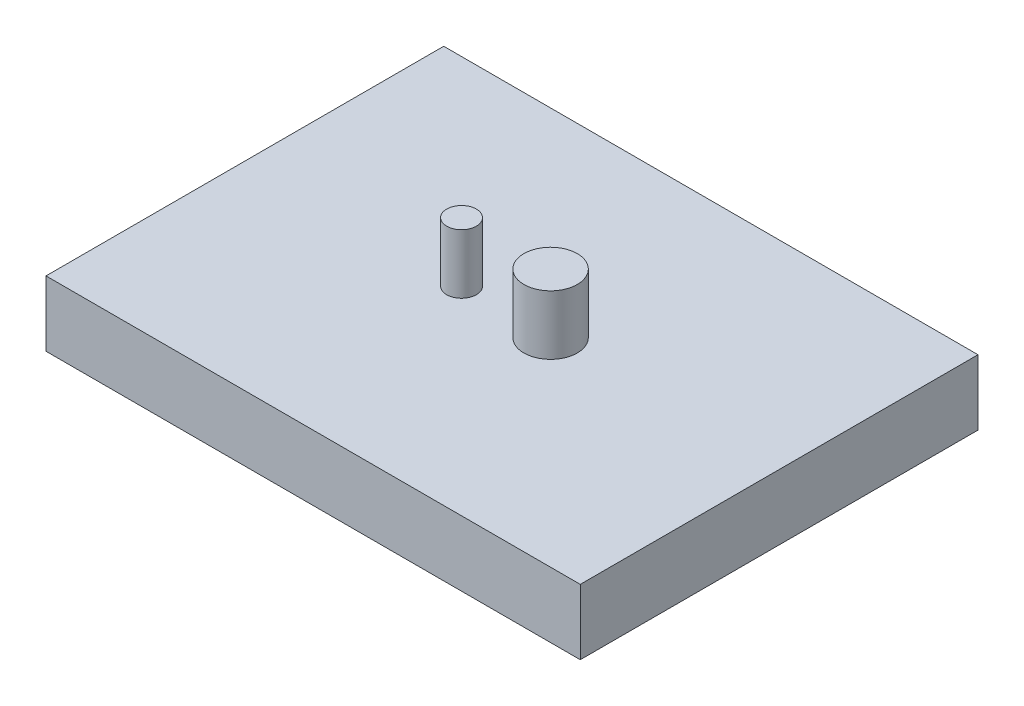
ISO-10303-21;
HEADER;
FILE_DESCRIPTION(('STEP AP214'),'2;1');
FILE_NAME('part.step','',(''),(''),'','','');
FILE_SCHEMA(('AUTOMOTIVE_DESIGN { 1 0 10303 214 1 1 1 1 }'));
ENDSEC;
DATA;
#1=APPLICATION_CONTEXT('core data for automotive mechanical design processes');
#2=APPLICATION_PROTOCOL_DEFINITION('international standard','automotive_design',2000,#1);
#3=PRODUCT_CONTEXT('',#1,'mechanical');
#4=PRODUCT('Part','Part','',(#3));
#5=PRODUCT_RELATED_PRODUCT_CATEGORY('part','',(#4));
#6=PRODUCT_DEFINITION_FORMATION('','',#4);
#7=PRODUCT_DEFINITION_CONTEXT('part definition',#1,'design');
#8=PRODUCT_DEFINITION('design','',#6,#7);
#9=PRODUCT_DEFINITION_SHAPE('','',#8);
#10=(LENGTH_UNIT() NAMED_UNIT(*) SI_UNIT(.MILLI.,.METRE.));
#11=(NAMED_UNIT(*) PLANE_ANGLE_UNIT() SI_UNIT($,.RADIAN.));
#12=(NAMED_UNIT(*) SI_UNIT($,.STERADIAN.) SOLID_ANGLE_UNIT());
#13=UNCERTAINTY_MEASURE_WITH_UNIT(LENGTH_MEASURE(1.E-05),#10,'distance_accuracy_value','');
#14=(GEOMETRIC_REPRESENTATION_CONTEXT(3) GLOBAL_UNCERTAINTY_ASSIGNED_CONTEXT((#13)) GLOBAL_UNIT_ASSIGNED_CONTEXT((#10,
#11,#12)) REPRESENTATION_CONTEXT('',''));
#15=CARTESIAN_POINT('',(0.,0.,0.));
#16=DIRECTION('',(0.,0.,1.));
#17=DIRECTION('',(1.,0.,0.));
#18=AXIS2_PLACEMENT_3D('',#15,#16,#17);
#19=CARTESIAN_POINT('',(0.,11.,0.));
#20=DIRECTION('',(0.,1.,0.));
#21=DIRECTION('',(0.,0.,1.));
#22=AXIS2_PLACEMENT_3D('',#19,#20,#21);
#23=PLANE('',#22);
#24=CARTESIAN_POINT('',(36.5,11.,33.5));
#25=DIRECTION('',(0.,1.,0.));
#26=DIRECTION('',(0.,0.,1.));
#27=AXIS2_PLACEMENT_3D('',#24,#25,#26);
#28=CIRCLE('',#27,2.5);
#29=CARTESIAN_POINT('',(36.5,11.,36.));
#30=VERTEX_POINT('',#29);
#31=EDGE_CURVE('E113',#30,#30,#28,.T.);
#32=ORIENTED_EDGE('',*,*,#31,.F.);
#33=EDGE_LOOP('',(#32));
#34=FACE_BOUND('',#33,.T.);
#35=DIRECTION('',(0.,0.,1.));
#36=VECTOR('',#35,1.);
#37=CARTESIAN_POINT('',(0.,11.,0.));
#38=LINE('',#37,#36);
#39=CARTESIAN_POINT('',(0.,11.,0.));
#40=VERTEX_POINT('',#39);
#41=CARTESIAN_POINT('',(0.,11.,67.));
#42=VERTEX_POINT('',#41);
#43=EDGE_CURVE('E87',#40,#42,#38,.T.);
#44=ORIENTED_EDGE('',*,*,#43,.T.);
#45=DIRECTION('',(1.,0.,0.));
#46=VECTOR('',#45,1.);
#47=CARTESIAN_POINT('',(0.,11.,67.));
#48=LINE('',#47,#46);
#49=CARTESIAN_POINT('',(90.,11.,67.));
#50=VERTEX_POINT('',#49);
#51=EDGE_CURVE('E82',#42,#50,#48,.T.);
#52=ORIENTED_EDGE('',*,*,#51,.T.);
#53=DIRECTION('',(0.,0.,-1.));
#54=VECTOR('',#53,1.);
#55=CARTESIAN_POINT('',(90.,11.,0.));
#56=LINE('',#55,#54);
#57=CARTESIAN_POINT('',(90.,11.,0.));
#58=VERTEX_POINT('',#57);
#59=EDGE_CURVE('E85',#50,#58,#56,.T.);
#60=ORIENTED_EDGE('',*,*,#59,.T.);
#61=DIRECTION('',(-1.,0.,0.));
#62=VECTOR('',#61,1.);
#63=CARTESIAN_POINT('',(0.,11.,0.));
#64=LINE('',#63,#62);
#65=EDGE_CURVE('E52',#58,#40,#64,.T.);
#66=ORIENTED_EDGE('',*,*,#65,.T.);
#67=EDGE_LOOP('',(#44,#52,#60,#66));
#68=FACE_BOUND('',#67,.T.);
#69=CARTESIAN_POINT('',(51.5,11.,33.5));
#70=DIRECTION('',(0.,1.,0.));
#71=DIRECTION('',(0.,0.,1.));
#72=AXIS2_PLACEMENT_3D('',#69,#70,#71);
#73=CIRCLE('',#72,4.5);
#74=CARTESIAN_POINT('',(51.5,11.,38.));
#75=VERTEX_POINT('',#74);
#76=EDGE_CURVE('E119',#75,#75,#73,.T.);
#77=ORIENTED_EDGE('',*,*,#76,.F.);
#78=EDGE_LOOP('',(#77));
#79=FACE_BOUND('',#78,.T.);
#80=ADVANCED_FACE('F35',(#34,#68,#79),#23,.T.);
#81=CARTESIAN_POINT('',(0.,11.,0.));
#82=DIRECTION('',(1.,0.,0.));
#83=DIRECTION('',(0.,0.,-1.));
#84=AXIS2_PLACEMENT_3D('',#81,#82,#83);
#85=PLANE('',#84);
#86=DIRECTION('',(0.,0.,1.));
#87=VECTOR('',#86,1.);
#88=CARTESIAN_POINT('',(0.,0.,0.));
#89=LINE('',#88,#87);
#90=CARTESIAN_POINT('',(0.,0.,0.));
#91=VERTEX_POINT('',#90);
#92=CARTESIAN_POINT('',(0.,0.,67.));
#93=VERTEX_POINT('',#92);
#94=EDGE_CURVE('E99',#91,#93,#89,.T.);
#95=ORIENTED_EDGE('',*,*,#94,.T.);
#96=DIRECTION('',(0.,-1.,0.));
#97=VECTOR('',#96,1.);
#98=CARTESIAN_POINT('',(0.,11.,67.));
#99=LINE('',#98,#97);
#100=EDGE_CURVE('E11',#42,#93,#99,.T.);
#101=ORIENTED_EDGE('',*,*,#100,.F.);
#102=ORIENTED_EDGE('',*,*,#43,.F.);
#103=DIRECTION('',(0.,-1.,0.));
#104=VECTOR('',#103,1.);
#105=CARTESIAN_POINT('',(0.,11.,0.));
#106=LINE('',#105,#104);
#107=EDGE_CURVE('E95',#40,#91,#106,.T.);
#108=ORIENTED_EDGE('',*,*,#107,.T.);
#109=EDGE_LOOP('',(#95,#101,#102,#108));
#110=FACE_BOUND('',#109,.T.);
#111=ADVANCED_FACE('F37',(#110),#85,.F.);
#112=CARTESIAN_POINT('',(0.,11.,67.));
#113=DIRECTION('',(0.,0.,-1.));
#114=DIRECTION('',(-1.,0.,0.));
#115=AXIS2_PLACEMENT_3D('',#112,#113,#114);
#116=PLANE('',#115);
#117=DIRECTION('',(1.,0.,0.));
#118=VECTOR('',#117,1.);
#119=CARTESIAN_POINT('',(0.,0.,67.));
#120=LINE('',#119,#118);
#121=CARTESIAN_POINT('',(90.,0.,67.));
#122=VERTEX_POINT('',#121);
#123=EDGE_CURVE('E91',#93,#122,#120,.T.);
#124=ORIENTED_EDGE('',*,*,#123,.T.);
#125=DIRECTION('',(0.,-1.,0.));
#126=VECTOR('',#125,1.);
#127=CARTESIAN_POINT('',(90.,11.,67.));
#128=LINE('',#127,#126);
#129=EDGE_CURVE('E44',#50,#122,#128,.T.);
#130=ORIENTED_EDGE('',*,*,#129,.F.);
#131=ORIENTED_EDGE('',*,*,#51,.F.);
#132=ORIENTED_EDGE('',*,*,#100,.T.);
#133=EDGE_LOOP('',(#124,#130,#131,#132));
#134=FACE_BOUND('',#133,.T.);
#135=ADVANCED_FACE('F90',(#134),#116,.F.);
#136=CARTESIAN_POINT('',(90.,11.,0.));
#137=DIRECTION('',(-1.,0.,0.));
#138=DIRECTION('',(0.,0.,1.));
#139=AXIS2_PLACEMENT_3D('',#136,#137,#138);
#140=PLANE('',#139);
#141=DIRECTION('',(0.,0.,-1.));
#142=VECTOR('',#141,1.);
#143=CARTESIAN_POINT('',(90.,0.,0.));
#144=LINE('',#143,#142);
#145=CARTESIAN_POINT('',(90.,0.,0.));
#146=VERTEX_POINT('',#145);
#147=EDGE_CURVE('E69',#122,#146,#144,.T.);
#148=ORIENTED_EDGE('',*,*,#147,.T.);
#149=DIRECTION('',(0.,-1.,0.));
#150=VECTOR('',#149,1.);
#151=CARTESIAN_POINT('',(90.,11.,0.));
#152=LINE('',#151,#150);
#153=EDGE_CURVE('E92',#58,#146,#152,.T.);
#154=ORIENTED_EDGE('',*,*,#153,.F.);
#155=ORIENTED_EDGE('',*,*,#59,.F.);
#156=ORIENTED_EDGE('',*,*,#129,.T.);
#157=EDGE_LOOP('',(#148,#154,#155,#156));
#158=FACE_BOUND('',#157,.T.);
#159=ADVANCED_FACE('F93',(#158),#140,.F.);
#160=CARTESIAN_POINT('',(0.,11.,0.));
#161=DIRECTION('',(0.,0.,1.));
#162=DIRECTION('',(1.,0.,0.));
#163=AXIS2_PLACEMENT_3D('',#160,#161,#162);
#164=PLANE('',#163);
#165=DIRECTION('',(-1.,0.,0.));
#166=VECTOR('',#165,1.);
#167=CARTESIAN_POINT('',(0.,0.,0.));
#168=LINE('',#167,#166);
#169=EDGE_CURVE('E75',#146,#91,#168,.T.);
#170=ORIENTED_EDGE('',*,*,#169,.T.);
#171=ORIENTED_EDGE('',*,*,#107,.F.);
#172=ORIENTED_EDGE('',*,*,#65,.F.);
#173=ORIENTED_EDGE('',*,*,#153,.T.);
#174=EDGE_LOOP('',(#170,#171,#172,#173));
#175=FACE_BOUND('',#174,.T.);
#176=ADVANCED_FACE('F107',(#175),#164,.F.);
#177=CARTESIAN_POINT('',(0.,0.,0.));
#178=DIRECTION('',(0.,1.,0.));
#179=DIRECTION('',(0.,0.,1.));
#180=AXIS2_PLACEMENT_3D('',#177,#178,#179);
#181=PLANE('',#180);
#182=ORIENTED_EDGE('',*,*,#94,.F.);
#183=ORIENTED_EDGE('',*,*,#169,.F.);
#184=ORIENTED_EDGE('',*,*,#147,.F.);
#185=ORIENTED_EDGE('',*,*,#123,.F.);
#186=EDGE_LOOP('',(#182,#183,#184,#185));
#187=FACE_BOUND('',#186,.T.);
#188=ADVANCED_FACE('F110',(#187),#181,.F.);
#189=CARTESIAN_POINT('',(36.5,21.,33.5));
#190=DIRECTION('',(0.,-1.,0.));
#191=DIRECTION('',(0.,0.,-1.));
#192=AXIS2_PLACEMENT_3D('',#189,#190,#191);
#193=CYLINDRICAL_SURFACE('',#192,2.5);
#194=CARTESIAN_POINT('',(36.5,21.,33.5));
#195=DIRECTION('',(0.,1.,0.));
#196=DIRECTION('',(0.,0.,1.));
#197=AXIS2_PLACEMENT_3D('',#194,#195,#196);
#198=CIRCLE('',#197,2.5);
#199=CARTESIAN_POINT('',(36.5,21.,36.));
#200=VERTEX_POINT('',#199);
#201=EDGE_CURVE('E102',#200,#200,#198,.T.);
#202=ORIENTED_EDGE('',*,*,#201,.F.);
#203=EDGE_LOOP('',(#202));
#204=FACE_BOUND('',#203,.T.);
#205=ORIENTED_EDGE('',*,*,#31,.T.);
#206=EDGE_LOOP('',(#205));
#207=FACE_BOUND('',#206,.T.);
#208=ADVANCED_FACE('F142',(#204,#207),#193,.T.);
#209=CARTESIAN_POINT('',(36.5,21.,33.5));
#210=DIRECTION('',(0.,1.,0.));
#211=DIRECTION('',(0.,0.,1.));
#212=AXIS2_PLACEMENT_3D('',#209,#210,#211);
#213=PLANE('',#212);
#214=ORIENTED_EDGE('',*,*,#201,.T.);
#215=EDGE_LOOP('',(#214));
#216=FACE_BOUND('',#215,.T.);
#217=ADVANCED_FACE('F130',(#216),#213,.T.);
#218=CARTESIAN_POINT('',(51.5,21.,33.5));
#219=DIRECTION('',(0.,-1.,0.));
#220=DIRECTION('',(0.,0.,-1.));
#221=AXIS2_PLACEMENT_3D('',#218,#219,#220);
#222=CYLINDRICAL_SURFACE('',#221,4.5);
#223=CARTESIAN_POINT('',(51.5,21.,33.5));
#224=DIRECTION('',(0.,1.,0.));
#225=DIRECTION('',(0.,0.,1.));
#226=AXIS2_PLACEMENT_3D('',#223,#224,#225);
#227=CIRCLE('',#226,4.5);
#228=CARTESIAN_POINT('',(51.5,21.,38.));
#229=VERTEX_POINT('',#228);
#230=EDGE_CURVE('E116',#229,#229,#227,.T.);
#231=ORIENTED_EDGE('',*,*,#230,.F.);
#232=EDGE_LOOP('',(#231));
#233=FACE_BOUND('',#232,.T.);
#234=ORIENTED_EDGE('',*,*,#76,.T.);
#235=EDGE_LOOP('',(#234));
#236=FACE_BOUND('',#235,.T.);
#237=ADVANCED_FACE('F127',(#233,#236),#222,.T.);
#238=CARTESIAN_POINT('',(51.5,21.,33.5));
#239=DIRECTION('',(0.,1.,0.));
#240=DIRECTION('',(0.,0.,1.));
#241=AXIS2_PLACEMENT_3D('',#238,#239,#240);
#242=PLANE('',#241);
#243=ORIENTED_EDGE('',*,*,#230,.T.);
#244=EDGE_LOOP('',(#243));
#245=FACE_BOUND('',#244,.T.);
#246=ADVANCED_FACE('F125',(#245),#242,.T.);
#247=CLOSED_SHELL('',(#80,#111,#135,#159,#176,#188,#208,#217,#237,#246));
#248=MANIFOLD_SOLID_BREP('B2',#247);
#249=ADVANCED_BREP_SHAPE_REPRESENTATION('',(#18,#248),#14);
#250=SHAPE_DEFINITION_REPRESENTATION(#9,#249);
ENDSEC;
END-ISO-10303-21;
